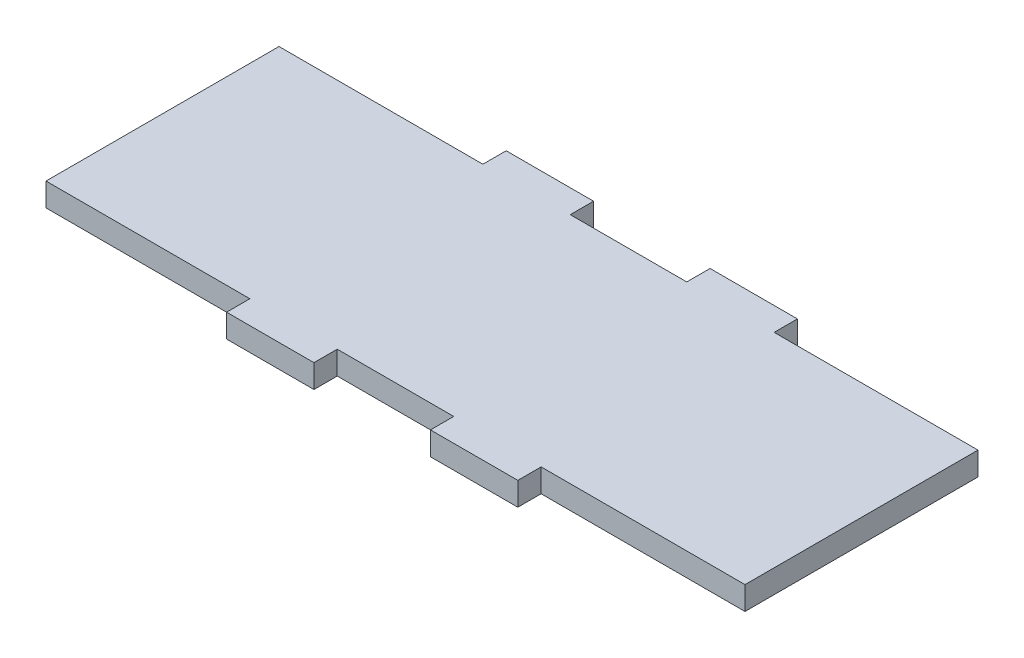
ISO-10303-21;
HEADER;
FILE_DESCRIPTION(('STEP AP214'),'2;1');
FILE_NAME('part.step','',(''),(''),'','','');
FILE_SCHEMA(('AUTOMOTIVE_DESIGN { 1 0 10303 214 1 1 1 1 }'));
ENDSEC;
DATA;
#1=APPLICATION_CONTEXT('core data for automotive mechanical design processes');
#2=APPLICATION_PROTOCOL_DEFINITION('international standard','automotive_design',2000,#1);
#3=PRODUCT_CONTEXT('',#1,'mechanical');
#4=PRODUCT('Part','Part','',(#3));
#5=PRODUCT_RELATED_PRODUCT_CATEGORY('part','',(#4));
#6=PRODUCT_DEFINITION_FORMATION('','',#4);
#7=PRODUCT_DEFINITION_CONTEXT('part definition',#1,'design');
#8=PRODUCT_DEFINITION('design','',#6,#7);
#9=PRODUCT_DEFINITION_SHAPE('','',#8);
#10=(LENGTH_UNIT() NAMED_UNIT(*) SI_UNIT(.MILLI.,.METRE.));
#11=(NAMED_UNIT(*) PLANE_ANGLE_UNIT() SI_UNIT($,.RADIAN.));
#12=(NAMED_UNIT(*) SI_UNIT($,.STERADIAN.) SOLID_ANGLE_UNIT());
#13=UNCERTAINTY_MEASURE_WITH_UNIT(LENGTH_MEASURE(1.E-05),#10,'distance_accuracy_value','');
#14=(GEOMETRIC_REPRESENTATION_CONTEXT(3) GLOBAL_UNCERTAINTY_ASSIGNED_CONTEXT((#13)) GLOBAL_UNIT_ASSIGNED_CONTEXT((#10,
#11,#12)) REPRESENTATION_CONTEXT('',''));
#15=CARTESIAN_POINT('',(0.,0.,0.));
#16=DIRECTION('',(0.,0.,1.));
#17=DIRECTION('',(1.,0.,0.));
#18=AXIS2_PLACEMENT_3D('',#15,#16,#17);
#19=CARTESIAN_POINT('',(59.9999999999999,2.,48.));
#20=DIRECTION('',(-1.,0.,0.));
#21=DIRECTION('',(0.,0.,1.));
#22=AXIS2_PLACEMENT_3D('',#19,#20,#21);
#23=PLANE('',#22);
#24=DIRECTION('',(0.,-1.,0.));
#25=VECTOR('',#24,1.);
#26=CARTESIAN_POINT('',(59.9999999999999,46.,4.00000000000001));
#27=LINE('',#26,#25);
#28=CARTESIAN_POINT('',(59.9999999999999,2.,4.00000000000001));
#29=VERTEX_POINT('',#28);
#30=CARTESIAN_POINT('',(59.9999999999999,-2.,4.00000000000001));
#31=VERTEX_POINT('',#30);
#32=EDGE_CURVE('E221',#29,#31,#27,.T.);
#33=ORIENTED_EDGE('',*,*,#32,.F.);
#34=DIRECTION('',(0.,0.,-1.));
#35=VECTOR('',#34,1.);
#36=CARTESIAN_POINT('',(59.9999999999999,2.,48.));
#37=LINE('',#36,#35);
#38=CARTESIAN_POINT('',(59.9999999999999,2.,44.));
#39=VERTEX_POINT('',#38);
#40=EDGE_CURVE('E364',#39,#29,#37,.T.);
#41=ORIENTED_EDGE('',*,*,#40,.F.);
#42=DIRECTION('',(0.,-1.,0.));
#43=VECTOR('',#42,1.);
#44=CARTESIAN_POINT('',(59.9999999999999,46.,44.));
#45=LINE('',#44,#43);
#46=CARTESIAN_POINT('',(59.9999999999999,-2.,44.));
#47=VERTEX_POINT('',#46);
#48=EDGE_CURVE('E203',#39,#47,#45,.T.);
#49=ORIENTED_EDGE('',*,*,#48,.T.);
#50=DIRECTION('',(0.,0.,-1.));
#51=VECTOR('',#50,1.);
#52=CARTESIAN_POINT('',(59.9999999999999,-2.,48.));
#53=LINE('',#52,#51);
#54=EDGE_CURVE('E352',#47,#31,#53,.T.);
#55=ORIENTED_EDGE('',*,*,#54,.T.);
#56=EDGE_LOOP('',(#33,#41,#49,#55));
#57=FACE_BOUND('',#56,.T.);
#58=ADVANCED_FACE('F46',(#57),#23,.F.);
#59=CARTESIAN_POINT('',(-60.0000000000001,2.,48.));
#60=DIRECTION('',(0.,-1.,0.));
#61=DIRECTION('',(0.,0.,-1.));
#62=AXIS2_PLACEMENT_3D('',#59,#60,#61);
#63=PLANE('',#62);
#64=DIRECTION('',(1.,0.,0.));
#65=VECTOR('',#64,1.);
#66=CARTESIAN_POINT('',(-60.0000000000001,2.,3.99999999999999));
#67=LINE('',#66,#65);
#68=CARTESIAN_POINT('',(-60.0000000000001,2.,3.99999999999999));
#69=VERTEX_POINT('',#68);
#70=CARTESIAN_POINT('',(-25.,2.,3.99999999999999));
#71=VERTEX_POINT('',#70);
#72=EDGE_CURVE('E329',#69,#71,#67,.T.);
#73=ORIENTED_EDGE('',*,*,#72,.F.);
#74=DIRECTION('',(0.,0.,-1.));
#75=VECTOR('',#74,1.);
#76=CARTESIAN_POINT('',(-60.0000000000001,2.,48.));
#77=LINE('',#76,#75);
#78=CARTESIAN_POINT('',(-60.0000000000001,2.,44.));
#79=VERTEX_POINT('',#78);
#80=EDGE_CURVE('E360',#79,#69,#77,.T.);
#81=ORIENTED_EDGE('',*,*,#80,.F.);
#82=DIRECTION('',(1.,0.,0.));
#83=VECTOR('',#82,1.);
#84=CARTESIAN_POINT('',(-60.0000000000001,2.,44.));
#85=LINE('',#84,#83);
#86=CARTESIAN_POINT('',(-25.,2.,44.));
#87=VERTEX_POINT('',#86);
#88=EDGE_CURVE('E313',#79,#87,#85,.T.);
#89=ORIENTED_EDGE('',*,*,#88,.T.);
#90=DIRECTION('',(0.,0.,-1.));
#91=VECTOR('',#90,1.);
#92=CARTESIAN_POINT('',(-25.,2.,48.));
#93=LINE('',#92,#91);
#94=CARTESIAN_POINT('',(-25.,2.,48.));
#95=VERTEX_POINT('',#94);
#96=EDGE_CURVE('E300',#95,#87,#93,.T.);
#97=ORIENTED_EDGE('',*,*,#96,.F.);
#98=DIRECTION('',(-1.,0.,0.));
#99=VECTOR('',#98,1.);
#100=CARTESIAN_POINT('',(-60.0000000000001,2.,48.));
#101=LINE('',#100,#99);
#102=CARTESIAN_POINT('',(-10.,2.,48.));
#103=VERTEX_POINT('',#102);
#104=EDGE_CURVE('E333',#103,#95,#101,.T.);
#105=ORIENTED_EDGE('',*,*,#104,.F.);
#106=DIRECTION('',(0.,0.,-1.));
#107=VECTOR('',#106,1.);
#108=CARTESIAN_POINT('',(-10.,2.,48.));
#109=LINE('',#108,#107);
#110=CARTESIAN_POINT('',(-10.,2.,44.));
#111=VERTEX_POINT('',#110);
#112=EDGE_CURVE('E306',#103,#111,#109,.T.);
#113=ORIENTED_EDGE('',*,*,#112,.T.);
#114=DIRECTION('',(1.,0.,0.));
#115=VECTOR('',#114,1.);
#116=CARTESIAN_POINT('',(-60.0000000000001,2.,44.));
#117=LINE('',#116,#115);
#118=CARTESIAN_POINT('',(10.,2.,44.));
#119=VERTEX_POINT('',#118);
#120=EDGE_CURVE('E189',#111,#119,#117,.T.);
#121=ORIENTED_EDGE('',*,*,#120,.T.);
#122=DIRECTION('',(0.,0.,-1.));
#123=VECTOR('',#122,1.);
#124=CARTESIAN_POINT('',(9.99999999999999,2.,48.));
#125=LINE('',#124,#123);
#126=CARTESIAN_POINT('',(10.,2.,48.));
#127=VERTEX_POINT('',#126);
#128=EDGE_CURVE('E303',#127,#119,#125,.T.);
#129=ORIENTED_EDGE('',*,*,#128,.F.);
#130=CARTESIAN_POINT('',(25.,2.,48.));
#131=VERTEX_POINT('',#130);
#132=EDGE_CURVE('E337',#131,#127,#101,.T.);
#133=ORIENTED_EDGE('',*,*,#132,.F.);
#134=DIRECTION('',(0.,0.,-1.));
#135=VECTOR('',#134,1.);
#136=CARTESIAN_POINT('',(25.,2.,48.0000000000001));
#137=LINE('',#136,#135);
#138=CARTESIAN_POINT('',(25.,2.,44.));
#139=VERTEX_POINT('',#138);
#140=EDGE_CURVE('E309',#131,#139,#137,.T.);
#141=ORIENTED_EDGE('',*,*,#140,.T.);
#142=DIRECTION('',(1.,0.,0.));
#143=VECTOR('',#142,1.);
#144=CARTESIAN_POINT('',(-60.0000000000001,2.,44.));
#145=LINE('',#144,#143);
#146=EDGE_CURVE('E319',#139,#39,#145,.T.);
#147=ORIENTED_EDGE('',*,*,#146,.T.);
#148=ORIENTED_EDGE('',*,*,#40,.T.);
#149=DIRECTION('',(1.,0.,0.));
#150=VECTOR('',#149,1.);
#151=CARTESIAN_POINT('',(-60.0000000000001,2.,3.99999999999999));
#152=LINE('',#151,#150);
#153=CARTESIAN_POINT('',(25.,2.,4.00000000000002));
#154=VERTEX_POINT('',#153);
#155=EDGE_CURVE('E323',#154,#29,#152,.T.);
#156=ORIENTED_EDGE('',*,*,#155,.F.);
#157=DIRECTION('',(0.,0.,1.));
#158=VECTOR('',#157,1.);
#159=CARTESIAN_POINT('',(25.,2.,48.));
#160=LINE('',#159,#158);
#161=CARTESIAN_POINT('',(25.,2.,0.));
#162=VERTEX_POINT('',#161);
#163=EDGE_CURVE('E284',#162,#154,#160,.T.);
#164=ORIENTED_EDGE('',*,*,#163,.F.);
#165=DIRECTION('',(-1.,0.,0.));
#166=VECTOR('',#165,1.);
#167=CARTESIAN_POINT('',(-60.0000000000001,2.,0.));
#168=LINE('',#167,#166);
#169=CARTESIAN_POINT('',(10.,2.,0.));
#170=VERTEX_POINT('',#169);
#171=EDGE_CURVE('E347',#162,#170,#168,.T.);
#172=ORIENTED_EDGE('',*,*,#171,.T.);
#173=DIRECTION('',(0.,0.,1.));
#174=VECTOR('',#173,1.);
#175=CARTESIAN_POINT('',(9.99999999999999,2.,48.));
#176=LINE('',#175,#174);
#177=CARTESIAN_POINT('',(10.,2.,4.00000000000001));
#178=VERTEX_POINT('',#177);
#179=EDGE_CURVE('E292',#170,#178,#176,.T.);
#180=ORIENTED_EDGE('',*,*,#179,.T.);
#181=DIRECTION('',(1.,0.,0.));
#182=VECTOR('',#181,1.);
#183=CARTESIAN_POINT('',(-60.0000000000001,2.,3.99999999999999));
#184=LINE('',#183,#182);
#185=CARTESIAN_POINT('',(-10.,2.,4.));
#186=VERTEX_POINT('',#185);
#187=EDGE_CURVE('E326',#186,#178,#184,.T.);
#188=ORIENTED_EDGE('',*,*,#187,.F.);
#189=DIRECTION('',(0.,0.,1.));
#190=VECTOR('',#189,1.);
#191=CARTESIAN_POINT('',(-9.99999999999998,2.,48.));
#192=LINE('',#191,#190);
#193=CARTESIAN_POINT('',(-10.,2.,0.));
#194=VERTEX_POINT('',#193);
#195=EDGE_CURVE('E289',#194,#186,#192,.T.);
#196=ORIENTED_EDGE('',*,*,#195,.F.);
#197=CARTESIAN_POINT('',(-25.,2.,0.));
#198=VERTEX_POINT('',#197);
#199=EDGE_CURVE('E332',#194,#198,#168,.T.);
#200=ORIENTED_EDGE('',*,*,#199,.T.);
#201=DIRECTION('',(0.,0.,1.));
#202=VECTOR('',#201,1.);
#203=CARTESIAN_POINT('',(-25.,2.,48.));
#204=LINE('',#203,#202);
#205=EDGE_CURVE('E296',#198,#71,#204,.T.);
#206=ORIENTED_EDGE('',*,*,#205,.T.);
#207=EDGE_LOOP('',(#73,#81,#89,#97,#105,#113,#121,#129,#133,#141,#147,#148,#156,#164,#172,#180,
#188,#196,#200,#206));
#208=FACE_BOUND('',#207,.T.);
#209=ADVANCED_FACE('F399',(#208),#63,.F.);
#210=CARTESIAN_POINT('',(-60.0000000000001,2.,48.));
#211=DIRECTION('',(1.,0.,0.));
#212=DIRECTION('',(0.,0.,-1.));
#213=AXIS2_PLACEMENT_3D('',#210,#211,#212);
#214=PLANE('',#213);
#215=DIRECTION('',(0.,-1.,0.));
#216=VECTOR('',#215,1.);
#217=CARTESIAN_POINT('',(-60.0000000000001,46.,3.99999999999999));
#218=LINE('',#217,#216);
#219=CARTESIAN_POINT('',(-60.0000000000001,-2.,3.99999999999999));
#220=VERTEX_POINT('',#219);
#221=EDGE_CURVE('E269',#69,#220,#218,.T.);
#222=ORIENTED_EDGE('',*,*,#221,.T.);
#223=DIRECTION('',(0.,0.,-1.));
#224=VECTOR('',#223,1.);
#225=CARTESIAN_POINT('',(-60.0000000000001,-2.,48.));
#226=LINE('',#225,#224);
#227=CARTESIAN_POINT('',(-60.0000000000001,-2.,44.));
#228=VERTEX_POINT('',#227);
#229=EDGE_CURVE('E356',#228,#220,#226,.T.);
#230=ORIENTED_EDGE('',*,*,#229,.F.);
#231=DIRECTION('',(0.,-1.,0.));
#232=VECTOR('',#231,1.);
#233=CARTESIAN_POINT('',(-60.0000000000001,46.,44.));
#234=LINE('',#233,#232);
#235=EDGE_CURVE('E280',#79,#228,#234,.T.);
#236=ORIENTED_EDGE('',*,*,#235,.F.);
#237=ORIENTED_EDGE('',*,*,#80,.T.);
#238=EDGE_LOOP('',(#222,#230,#236,#237));
#239=FACE_BOUND('',#238,.T.);
#240=ADVANCED_FACE('F430',(#239),#214,.F.);
#241=CARTESIAN_POINT('',(-60.0000000000001,-2.,48.));
#242=DIRECTION('',(0.,1.,0.));
#243=DIRECTION('',(0.,0.,1.));
#244=AXIS2_PLACEMENT_3D('',#241,#242,#243);
#245=PLANE('',#244);
#246=DIRECTION('',(1.,0.,0.));
#247=VECTOR('',#246,1.);
#248=CARTESIAN_POINT('',(0.,-2.,4.00000000000001));
#249=LINE('',#248,#247);
#250=CARTESIAN_POINT('',(-25.,-2.,3.99999999999999));
#251=VERTEX_POINT('',#250);
#252=EDGE_CURVE('E262',#220,#251,#249,.T.);
#253=ORIENTED_EDGE('',*,*,#252,.T.);
#254=DIRECTION('',(0.,0.,1.));
#255=VECTOR('',#254,1.);
#256=CARTESIAN_POINT('',(-25.,-2.,0.));
#257=LINE('',#256,#255);
#258=CARTESIAN_POINT('',(-25.,-2.,0.));
#259=VERTEX_POINT('',#258);
#260=EDGE_CURVE('E265',#259,#251,#257,.T.);
#261=ORIENTED_EDGE('',*,*,#260,.F.);
#262=DIRECTION('',(1.,0.,0.));
#263=VECTOR('',#262,1.);
#264=CARTESIAN_POINT('',(-60.0000000000001,-2.,0.));
#265=LINE('',#264,#263);
#266=CARTESIAN_POINT('',(-10.,-2.,0.));
#267=VERTEX_POINT('',#266);
#268=EDGE_CURVE('E338',#259,#267,#265,.T.);
#269=ORIENTED_EDGE('',*,*,#268,.T.);
#270=DIRECTION('',(0.,0.,1.));
#271=VECTOR('',#270,1.);
#272=CARTESIAN_POINT('',(-10.,-2.,0.));
#273=LINE('',#272,#271);
#274=CARTESIAN_POINT('',(-10.,-2.,4.));
#275=VERTEX_POINT('',#274);
#276=EDGE_CURVE('E248',#267,#275,#273,.T.);
#277=ORIENTED_EDGE('',*,*,#276,.T.);
#278=DIRECTION('',(1.,0.,0.));
#279=VECTOR('',#278,1.);
#280=CARTESIAN_POINT('',(0.,-2.,4.00000000000001));
#281=LINE('',#280,#279);
#282=CARTESIAN_POINT('',(10.,-2.,4.00000000000001));
#283=VERTEX_POINT('',#282);
#284=EDGE_CURVE('E244',#275,#283,#281,.T.);
#285=ORIENTED_EDGE('',*,*,#284,.T.);
#286=DIRECTION('',(0.,0.,1.));
#287=VECTOR('',#286,1.);
#288=CARTESIAN_POINT('',(10.,-2.,0.));
#289=LINE('',#288,#287);
#290=CARTESIAN_POINT('',(10.,-2.,0.));
#291=VERTEX_POINT('',#290);
#292=EDGE_CURVE('E253',#291,#283,#289,.T.);
#293=ORIENTED_EDGE('',*,*,#292,.F.);
#294=CARTESIAN_POINT('',(25.,-2.,0.));
#295=VERTEX_POINT('',#294);
#296=EDGE_CURVE('E348',#291,#295,#265,.T.);
#297=ORIENTED_EDGE('',*,*,#296,.T.);
#298=DIRECTION('',(0.,0.,1.));
#299=VECTOR('',#298,1.);
#300=CARTESIAN_POINT('',(25.,-2.,0.));
#301=LINE('',#300,#299);
#302=CARTESIAN_POINT('',(25.,-2.,4.00000000000002));
#303=VERTEX_POINT('',#302);
#304=EDGE_CURVE('E234',#295,#303,#301,.T.);
#305=ORIENTED_EDGE('',*,*,#304,.T.);
#306=DIRECTION('',(1.,0.,0.));
#307=VECTOR('',#306,1.);
#308=CARTESIAN_POINT('',(0.,-2.,4.00000000000001));
#309=LINE('',#308,#307);
#310=EDGE_CURVE('E230',#303,#31,#309,.T.);
#311=ORIENTED_EDGE('',*,*,#310,.T.);
#312=ORIENTED_EDGE('',*,*,#54,.F.);
#313=DIRECTION('',(1.,0.,0.));
#314=VECTOR('',#313,1.);
#315=CARTESIAN_POINT('',(0.,-2.,44.));
#316=LINE('',#315,#314);
#317=CARTESIAN_POINT('',(25.,-2.,44.));
#318=VERTEX_POINT('',#317);
#319=EDGE_CURVE('E220',#318,#47,#316,.T.);
#320=ORIENTED_EDGE('',*,*,#319,.F.);
#321=DIRECTION('',(0.,0.,-1.));
#322=VECTOR('',#321,1.);
#323=CARTESIAN_POINT('',(25.,-2.,0.));
#324=LINE('',#323,#322);
#325=CARTESIAN_POINT('',(25.,-2.,48.));
#326=VERTEX_POINT('',#325);
#327=EDGE_CURVE('E216',#326,#318,#324,.T.);
#328=ORIENTED_EDGE('',*,*,#327,.F.);
#329=DIRECTION('',(1.,0.,0.));
#330=VECTOR('',#329,1.);
#331=CARTESIAN_POINT('',(-60.0000000000001,-2.,48.));
#332=LINE('',#331,#330);
#333=CARTESIAN_POINT('',(9.99999999999999,-2.,48.));
#334=VERTEX_POINT('',#333);
#335=EDGE_CURVE('E339',#334,#326,#332,.T.);
#336=ORIENTED_EDGE('',*,*,#335,.F.);
#337=DIRECTION('',(0.,0.,-1.));
#338=VECTOR('',#337,1.);
#339=CARTESIAN_POINT('',(10.,-2.,0.));
#340=LINE('',#339,#338);
#341=CARTESIAN_POINT('',(10.,-2.,44.));
#342=VERTEX_POINT('',#341);
#343=EDGE_CURVE('E61',#334,#342,#340,.T.);
#344=ORIENTED_EDGE('',*,*,#343,.T.);
#345=DIRECTION('',(1.,0.,0.));
#346=VECTOR('',#345,1.);
#347=CARTESIAN_POINT('',(0.,-2.,44.));
#348=LINE('',#347,#346);
#349=CARTESIAN_POINT('',(-10.,-2.,44.));
#350=VERTEX_POINT('',#349);
#351=EDGE_CURVE('E187',#350,#342,#348,.T.);
#352=ORIENTED_EDGE('',*,*,#351,.F.);
#353=DIRECTION('',(0.,0.,-1.));
#354=VECTOR('',#353,1.);
#355=CARTESIAN_POINT('',(-9.99999999999998,-2.,0.));
#356=LINE('',#355,#354);
#357=CARTESIAN_POINT('',(-10.,-2.,48.));
#358=VERTEX_POINT('',#357);
#359=EDGE_CURVE('E196',#358,#350,#356,.T.);
#360=ORIENTED_EDGE('',*,*,#359,.F.);
#361=CARTESIAN_POINT('',(-25.,-2.,48.));
#362=VERTEX_POINT('',#361);
#363=EDGE_CURVE('E343',#362,#358,#332,.T.);
#364=ORIENTED_EDGE('',*,*,#363,.F.);
#365=DIRECTION('',(0.,0.,-1.));
#366=VECTOR('',#365,1.);
#367=CARTESIAN_POINT('',(-25.,-2.,0.));
#368=LINE('',#367,#366);
#369=CARTESIAN_POINT('',(-25.,-2.,44.));
#370=VERTEX_POINT('',#369);
#371=EDGE_CURVE('E69',#362,#370,#368,.T.);
#372=ORIENTED_EDGE('',*,*,#371,.T.);
#373=DIRECTION('',(1.,0.,0.));
#374=VECTOR('',#373,1.);
#375=CARTESIAN_POINT('',(0.,-2.,44.));
#376=LINE('',#375,#374);
#377=EDGE_CURVE('E214',#228,#370,#376,.T.);
#378=ORIENTED_EDGE('',*,*,#377,.F.);
#379=ORIENTED_EDGE('',*,*,#229,.T.);
#380=EDGE_LOOP('',(#253,#261,#269,#277,#285,#293,#297,#305,#311,#312,#320,#328,#336,#344,#352,
#360,#364,#372,#378,#379));
#381=FACE_BOUND('',#380,.T.);
#382=ADVANCED_FACE('F206',(#381),#245,.F.);
#383=CARTESIAN_POINT('',(0.,0.,48.));
#384=DIRECTION('',(0.,0.,1.));
#385=DIRECTION('',(1.,0.,0.));
#386=AXIS2_PLACEMENT_3D('',#383,#384,#385);
#387=PLANE('',#386);
#388=DIRECTION('',(0.,-1.,0.));
#389=VECTOR('',#388,1.);
#390=CARTESIAN_POINT('',(25.,0.,48.));
#391=LINE('',#390,#389);
#392=EDGE_CURVE('E12',#131,#326,#391,.T.);
#393=ORIENTED_EDGE('',*,*,#392,.F.);
#394=ORIENTED_EDGE('',*,*,#132,.T.);
#395=DIRECTION('',(0.,-1.,0.));
#396=VECTOR('',#395,1.);
#397=CARTESIAN_POINT('',(10.,0.,48.));
#398=LINE('',#397,#396);
#399=EDGE_CURVE('E385',#127,#334,#398,.T.);
#400=ORIENTED_EDGE('',*,*,#399,.T.);
#401=ORIENTED_EDGE('',*,*,#335,.T.);
#402=EDGE_LOOP('',(#393,#394,#400,#401));
#403=FACE_BOUND('',#402,.T.);
#404=ADVANCED_FACE('F445',(#403),#387,.T.);
#405=DIRECTION('',(0.,-1.,0.));
#406=VECTOR('',#405,1.);
#407=CARTESIAN_POINT('',(-10.,0.,48.));
#408=LINE('',#407,#406);
#409=EDGE_CURVE('E54',#103,#358,#408,.T.);
#410=ORIENTED_EDGE('',*,*,#409,.F.);
#411=ORIENTED_EDGE('',*,*,#104,.T.);
#412=DIRECTION('',(0.,-1.,0.));
#413=VECTOR('',#412,1.);
#414=CARTESIAN_POINT('',(-25.,0.,48.));
#415=LINE('',#414,#413);
#416=EDGE_CURVE('E382',#95,#362,#415,.T.);
#417=ORIENTED_EDGE('',*,*,#416,.T.);
#418=ORIENTED_EDGE('',*,*,#363,.T.);
#419=EDGE_LOOP('',(#410,#411,#417,#418));
#420=FACE_BOUND('',#419,.T.);
#421=ADVANCED_FACE('F440',(#420),#387,.T.);
#422=CARTESIAN_POINT('',(0.,0.,0.));
#423=DIRECTION('',(0.,0.,1.));
#424=DIRECTION('',(1.,0.,0.));
#425=AXIS2_PLACEMENT_3D('',#422,#423,#424);
#426=PLANE('',#425);
#427=ORIENTED_EDGE('',*,*,#268,.F.);
#428=DIRECTION('',(0.,1.,0.));
#429=VECTOR('',#428,1.);
#430=CARTESIAN_POINT('',(-25.,0.,0.));
#431=LINE('',#430,#429);
#432=EDGE_CURVE('E378',#259,#198,#431,.T.);
#433=ORIENTED_EDGE('',*,*,#432,.T.);
#434=ORIENTED_EDGE('',*,*,#199,.F.);
#435=DIRECTION('',(0.,1.,0.));
#436=VECTOR('',#435,1.);
#437=CARTESIAN_POINT('',(-10.,0.,0.));
#438=LINE('',#437,#436);
#439=EDGE_CURVE('E371',#267,#194,#438,.T.);
#440=ORIENTED_EDGE('',*,*,#439,.F.);
#441=EDGE_LOOP('',(#427,#433,#434,#440));
#442=FACE_BOUND('',#441,.T.);
#443=ADVANCED_FACE('F420',(#442),#426,.F.);
#444=ORIENTED_EDGE('',*,*,#296,.F.);
#445=DIRECTION('',(0.,1.,0.));
#446=VECTOR('',#445,1.);
#447=CARTESIAN_POINT('',(10.,0.,0.));
#448=LINE('',#447,#446);
#449=EDGE_CURVE('E374',#291,#170,#448,.T.);
#450=ORIENTED_EDGE('',*,*,#449,.T.);
#451=ORIENTED_EDGE('',*,*,#171,.F.);
#452=DIRECTION('',(0.,1.,0.));
#453=VECTOR('',#452,1.);
#454=CARTESIAN_POINT('',(25.,0.,0.));
#455=LINE('',#454,#453);
#456=EDGE_CURVE('E368',#295,#162,#455,.T.);
#457=ORIENTED_EDGE('',*,*,#456,.F.);
#458=EDGE_LOOP('',(#444,#450,#451,#457));
#459=FACE_BOUND('',#458,.T.);
#460=ADVANCED_FACE('F405',(#459),#426,.F.);
#461=CARTESIAN_POINT('',(0.,46.,4.00000000000001));
#462=DIRECTION('',(0.,0.,-1.));
#463=DIRECTION('',(-1.,0.,0.));
#464=AXIS2_PLACEMENT_3D('',#461,#462,#463);
#465=PLANE('',#464);
#466=ORIENTED_EDGE('',*,*,#155,.T.);
#467=ORIENTED_EDGE('',*,*,#32,.T.);
#468=ORIENTED_EDGE('',*,*,#310,.F.);
#469=DIRECTION('',(0.,-1.,0.));
#470=VECTOR('',#469,1.);
#471=CARTESIAN_POINT('',(25.,46.,4.00000000000002));
#472=LINE('',#471,#470);
#473=EDGE_CURVE('E239',#154,#303,#472,.T.);
#474=ORIENTED_EDGE('',*,*,#473,.F.);
#475=EDGE_LOOP('',(#466,#467,#468,#474));
#476=FACE_BOUND('',#475,.T.);
#477=ADVANCED_FACE('F459',(#476),#465,.T.);
#478=CARTESIAN_POINT('',(25.,46.,0.));
#479=DIRECTION('',(1.,0.,0.));
#480=DIRECTION('',(0.,0.,-1.));
#481=AXIS2_PLACEMENT_3D('',#478,#479,#480);
#482=PLANE('',#481);
#483=ORIENTED_EDGE('',*,*,#163,.T.);
#484=ORIENTED_EDGE('',*,*,#473,.T.);
#485=ORIENTED_EDGE('',*,*,#304,.F.);
#486=ORIENTED_EDGE('',*,*,#456,.T.);
#487=EDGE_LOOP('',(#483,#484,#485,#486));
#488=FACE_BOUND('',#487,.T.);
#489=ADVANCED_FACE('F462',(#488),#482,.T.);
#490=CARTESIAN_POINT('',(0.,46.,4.00000000000001));
#491=DIRECTION('',(0.,0.,-1.));
#492=DIRECTION('',(-1.,0.,0.));
#493=AXIS2_PLACEMENT_3D('',#490,#491,#492);
#494=PLANE('',#493);
#495=ORIENTED_EDGE('',*,*,#187,.T.);
#496=DIRECTION('',(0.,-1.,0.));
#497=VECTOR('',#496,1.);
#498=CARTESIAN_POINT('',(10.,46.,4.00000000000001));
#499=LINE('',#498,#497);
#500=EDGE_CURVE('E235',#178,#283,#499,.T.);
#501=ORIENTED_EDGE('',*,*,#500,.T.);
#502=ORIENTED_EDGE('',*,*,#284,.F.);
#503=DIRECTION('',(0.,-1.,0.));
#504=VECTOR('',#503,1.);
#505=CARTESIAN_POINT('',(-10.,46.,4.));
#506=LINE('',#505,#504);
#507=EDGE_CURVE('E257',#186,#275,#506,.T.);
#508=ORIENTED_EDGE('',*,*,#507,.F.);
#509=EDGE_LOOP('',(#495,#501,#502,#508));
#510=FACE_BOUND('',#509,.T.);
#511=ADVANCED_FACE('F413',(#510),#494,.T.);
#512=CARTESIAN_POINT('',(10.,46.,0.));
#513=DIRECTION('',(1.,0.,0.));
#514=DIRECTION('',(0.,0.,-1.));
#515=AXIS2_PLACEMENT_3D('',#512,#513,#514);
#516=PLANE('',#515);
#517=ORIENTED_EDGE('',*,*,#449,.F.);
#518=ORIENTED_EDGE('',*,*,#292,.T.);
#519=ORIENTED_EDGE('',*,*,#500,.F.);
#520=ORIENTED_EDGE('',*,*,#179,.F.);
#521=EDGE_LOOP('',(#517,#518,#519,#520));
#522=FACE_BOUND('',#521,.T.);
#523=ADVANCED_FACE('F408',(#522),#516,.F.);
#524=CARTESIAN_POINT('',(-10.,46.,0.));
#525=DIRECTION('',(1.,0.,0.));
#526=DIRECTION('',(0.,0.,-1.));
#527=AXIS2_PLACEMENT_3D('',#524,#525,#526);
#528=PLANE('',#527);
#529=ORIENTED_EDGE('',*,*,#195,.T.);
#530=ORIENTED_EDGE('',*,*,#507,.T.);
#531=ORIENTED_EDGE('',*,*,#276,.F.);
#532=ORIENTED_EDGE('',*,*,#439,.T.);
#533=EDGE_LOOP('',(#529,#530,#531,#532));
#534=FACE_BOUND('',#533,.T.);
#535=ADVANCED_FACE('F493',(#534),#528,.T.);
#536=CARTESIAN_POINT('',(0.,46.,4.00000000000001));
#537=DIRECTION('',(0.,0.,-1.));
#538=DIRECTION('',(-1.,0.,0.));
#539=AXIS2_PLACEMENT_3D('',#536,#537,#538);
#540=PLANE('',#539);
#541=ORIENTED_EDGE('',*,*,#72,.T.);
#542=DIRECTION('',(0.,-1.,0.));
#543=VECTOR('',#542,1.);
#544=CARTESIAN_POINT('',(-25.,46.,3.99999999999999));
#545=LINE('',#544,#543);
#546=EDGE_CURVE('E249',#71,#251,#545,.T.);
#547=ORIENTED_EDGE('',*,*,#546,.T.);
#548=ORIENTED_EDGE('',*,*,#252,.F.);
#549=ORIENTED_EDGE('',*,*,#221,.F.);
#550=EDGE_LOOP('',(#541,#547,#548,#549));
#551=FACE_BOUND('',#550,.T.);
#552=ADVANCED_FACE('F428',(#551),#540,.T.);
#553=CARTESIAN_POINT('',(-25.,46.,0.));
#554=DIRECTION('',(1.,0.,0.));
#555=DIRECTION('',(0.,0.,-1.));
#556=AXIS2_PLACEMENT_3D('',#553,#554,#555);
#557=PLANE('',#556);
#558=ORIENTED_EDGE('',*,*,#432,.F.);
#559=ORIENTED_EDGE('',*,*,#260,.T.);
#560=ORIENTED_EDGE('',*,*,#546,.F.);
#561=ORIENTED_EDGE('',*,*,#205,.F.);
#562=EDGE_LOOP('',(#558,#559,#560,#561));
#563=FACE_BOUND('',#562,.T.);
#564=ADVANCED_FACE('F423',(#563),#557,.F.);
#565=CARTESIAN_POINT('',(0.,46.,44.));
#566=DIRECTION('',(0.,0.,-1.));
#567=DIRECTION('',(-1.,0.,0.));
#568=AXIS2_PLACEMENT_3D('',#565,#566,#567);
#569=PLANE('',#568);
#570=ORIENTED_EDGE('',*,*,#235,.T.);
#571=ORIENTED_EDGE('',*,*,#377,.T.);
#572=DIRECTION('',(0.,-1.,0.));
#573=VECTOR('',#572,1.);
#574=CARTESIAN_POINT('',(-25.,46.,44.));
#575=LINE('',#574,#573);
#576=EDGE_CURVE('E281',#87,#370,#575,.T.);
#577=ORIENTED_EDGE('',*,*,#576,.F.);
#578=ORIENTED_EDGE('',*,*,#88,.F.);
#579=EDGE_LOOP('',(#570,#571,#577,#578));
#580=FACE_BOUND('',#579,.T.);
#581=ADVANCED_FACE('F437',(#580),#569,.F.);
#582=CARTESIAN_POINT('',(-25.,46.,0.));
#583=DIRECTION('',(-1.,0.,0.));
#584=DIRECTION('',(0.,0.,1.));
#585=AXIS2_PLACEMENT_3D('',#582,#583,#584);
#586=PLANE('',#585);
#587=ORIENTED_EDGE('',*,*,#96,.T.);
#588=ORIENTED_EDGE('',*,*,#576,.T.);
#589=ORIENTED_EDGE('',*,*,#371,.F.);
#590=ORIENTED_EDGE('',*,*,#416,.F.);
#591=EDGE_LOOP('',(#587,#588,#589,#590));
#592=FACE_BOUND('',#591,.T.);
#593=ADVANCED_FACE('F438',(#592),#586,.T.);
#594=CARTESIAN_POINT('',(0.,46.,44.));
#595=DIRECTION('',(0.,0.,-1.));
#596=DIRECTION('',(-1.,0.,0.));
#597=AXIS2_PLACEMENT_3D('',#594,#595,#596);
#598=PLANE('',#597);
#599=DIRECTION('',(0.,-1.,0.));
#600=VECTOR('',#599,1.);
#601=CARTESIAN_POINT('',(-10.,46.,44.));
#602=LINE('',#601,#600);
#603=EDGE_CURVE('E182',#111,#350,#602,.T.);
#604=ORIENTED_EDGE('',*,*,#603,.T.);
#605=ORIENTED_EDGE('',*,*,#351,.T.);
#606=DIRECTION('',(0.,-1.,0.));
#607=VECTOR('',#606,1.);
#608=CARTESIAN_POINT('',(10.,46.,44.));
#609=LINE('',#608,#607);
#610=EDGE_CURVE('E193',#119,#342,#609,.T.);
#611=ORIENTED_EDGE('',*,*,#610,.F.);
#612=ORIENTED_EDGE('',*,*,#120,.F.);
#613=EDGE_LOOP('',(#604,#605,#611,#612));
#614=FACE_BOUND('',#613,.T.);
#615=ADVANCED_FACE('F184',(#614),#598,.F.);
#616=CARTESIAN_POINT('',(-9.99999999999998,46.,0.));
#617=DIRECTION('',(-1.,0.,0.));
#618=DIRECTION('',(0.,0.,1.));
#619=AXIS2_PLACEMENT_3D('',#616,#617,#618);
#620=PLANE('',#619);
#621=ORIENTED_EDGE('',*,*,#409,.T.);
#622=ORIENTED_EDGE('',*,*,#359,.T.);
#623=ORIENTED_EDGE('',*,*,#603,.F.);
#624=ORIENTED_EDGE('',*,*,#112,.F.);
#625=EDGE_LOOP('',(#621,#622,#623,#624));
#626=FACE_BOUND('',#625,.T.);
#627=ADVANCED_FACE('F197',(#626),#620,.F.);
#628=CARTESIAN_POINT('',(10.,46.,0.));
#629=DIRECTION('',(-1.,0.,0.));
#630=DIRECTION('',(0.,0.,1.));
#631=AXIS2_PLACEMENT_3D('',#628,#629,#630);
#632=PLANE('',#631);
#633=ORIENTED_EDGE('',*,*,#128,.T.);
#634=ORIENTED_EDGE('',*,*,#610,.T.);
#635=ORIENTED_EDGE('',*,*,#343,.F.);
#636=ORIENTED_EDGE('',*,*,#399,.F.);
#637=EDGE_LOOP('',(#633,#634,#635,#636));
#638=FACE_BOUND('',#637,.T.);
#639=ADVANCED_FACE('F542',(#638),#632,.T.);
#640=CARTESIAN_POINT('',(0.,46.,44.));
#641=DIRECTION('',(0.,0.,-1.));
#642=DIRECTION('',(-1.,0.,0.));
#643=AXIS2_PLACEMENT_3D('',#640,#641,#642);
#644=PLANE('',#643);
#645=DIRECTION('',(0.,-1.,0.));
#646=VECTOR('',#645,1.);
#647=CARTESIAN_POINT('',(25.,46.,44.));
#648=LINE('',#647,#646);
#649=EDGE_CURVE('E224',#139,#318,#648,.T.);
#650=ORIENTED_EDGE('',*,*,#649,.T.);
#651=ORIENTED_EDGE('',*,*,#319,.T.);
#652=ORIENTED_EDGE('',*,*,#48,.F.);
#653=ORIENTED_EDGE('',*,*,#146,.F.);
#654=EDGE_LOOP('',(#650,#651,#652,#653));
#655=FACE_BOUND('',#654,.T.);
#656=ADVANCED_FACE('F453',(#655),#644,.F.);
#657=CARTESIAN_POINT('',(25.,46.,0.));
#658=DIRECTION('',(-1.,0.,0.));
#659=DIRECTION('',(0.,0.,1.));
#660=AXIS2_PLACEMENT_3D('',#657,#658,#659);
#661=PLANE('',#660);
#662=ORIENTED_EDGE('',*,*,#392,.T.);
#663=ORIENTED_EDGE('',*,*,#327,.T.);
#664=ORIENTED_EDGE('',*,*,#649,.F.);
#665=ORIENTED_EDGE('',*,*,#140,.F.);
#666=EDGE_LOOP('',(#662,#663,#664,#665));
#667=FACE_BOUND('',#666,.T.);
#668=ADVANCED_FACE('F448',(#667),#661,.F.);
#669=CLOSED_SHELL('',(#58,#209,#240,#382,#404,#421,#443,#460,#477,#489,#511,#523,#535,#552,#564,
#581,#593,#615,#627,#639,#656,#668));
#670=MANIFOLD_SOLID_BREP('B2',#669);
#671=ADVANCED_BREP_SHAPE_REPRESENTATION('',(#18,#670),#14);
#672=SHAPE_DEFINITION_REPRESENTATION(#9,#671);
ENDSEC;
END-ISO-10303-21;
